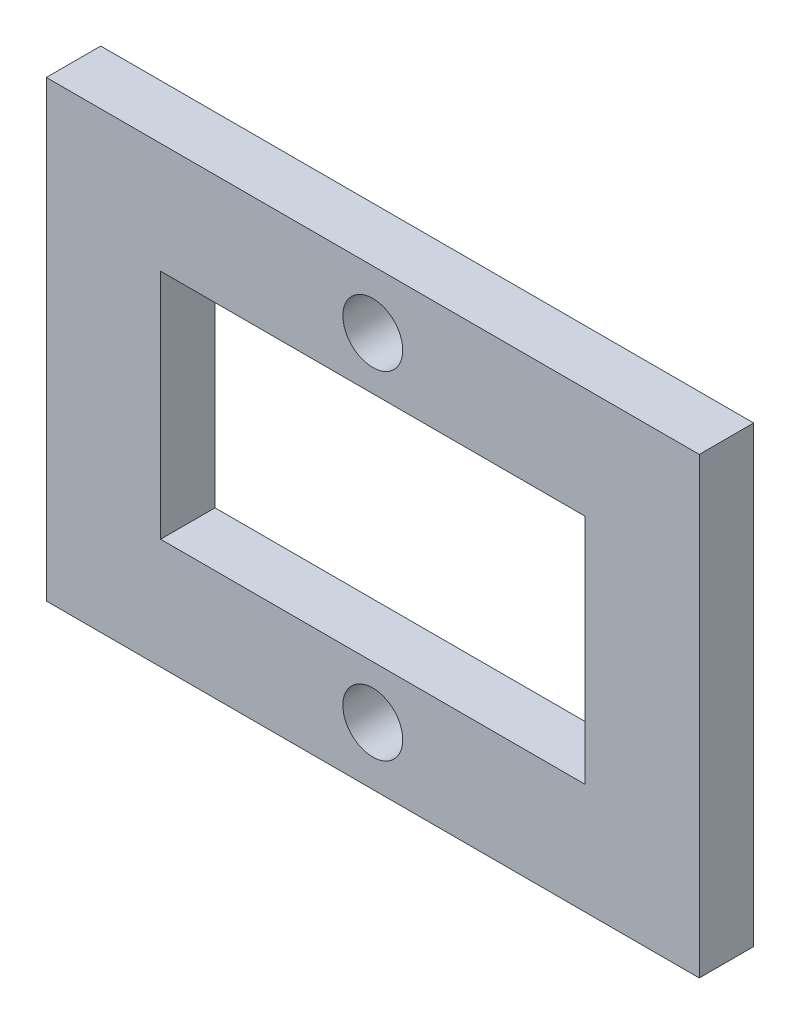
ISO-10303-21;
HEADER;
FILE_DESCRIPTION(('STEP AP214'),'2;1');
FILE_NAME('part.step','',(''),(''),'','','');
FILE_SCHEMA(('AUTOMOTIVE_DESIGN { 1 0 10303 214 1 1 1 1 }'));
ENDSEC;
DATA;
#1=APPLICATION_CONTEXT('core data for automotive mechanical design processes');
#2=APPLICATION_PROTOCOL_DEFINITION('international standard','automotive_design',2000,#1);
#3=PRODUCT_CONTEXT('',#1,'mechanical');
#4=PRODUCT('Part','Part','',(#3));
#5=PRODUCT_RELATED_PRODUCT_CATEGORY('part','',(#4));
#6=PRODUCT_DEFINITION_FORMATION('','',#4);
#7=PRODUCT_DEFINITION_CONTEXT('part definition',#1,'design');
#8=PRODUCT_DEFINITION('design','',#6,#7);
#9=PRODUCT_DEFINITION_SHAPE('','',#8);
#10=(LENGTH_UNIT() NAMED_UNIT(*) SI_UNIT(.MILLI.,.METRE.));
#11=(NAMED_UNIT(*) PLANE_ANGLE_UNIT() SI_UNIT($,.RADIAN.));
#12=(NAMED_UNIT(*) SI_UNIT($,.STERADIAN.) SOLID_ANGLE_UNIT());
#13=UNCERTAINTY_MEASURE_WITH_UNIT(LENGTH_MEASURE(1.E-05),#10,'distance_accuracy_value','');
#14=(GEOMETRIC_REPRESENTATION_CONTEXT(3) GLOBAL_UNCERTAINTY_ASSIGNED_CONTEXT((#13)) GLOBAL_UNIT_ASSIGNED_CONTEXT((#10,
#11,#12)) REPRESENTATION_CONTEXT('',''));
#15=CARTESIAN_POINT('',(0.,0.,0.));
#16=DIRECTION('',(0.,0.,1.));
#17=DIRECTION('',(1.,0.,0.));
#18=AXIS2_PLACEMENT_3D('',#15,#16,#17);
#19=CARTESIAN_POINT('',(244.7,9.3,22.75));
#20=DIRECTION('',(0.,0.,1.));
#21=DIRECTION('',(1.,0.,0.));
#22=AXIS2_PLACEMENT_3D('',#19,#20,#21);
#23=CYLINDRICAL_SURFACE('',#22,1.65);
#24=DIRECTION('',(0.,0.,1.));
#25=VECTOR('',#24,1.);
#26=CARTESIAN_POINT('',(246.35,9.3,22.75));
#27=LINE('',#26,#25);
#28=CARTESIAN_POINT('',(246.35,9.3,23.75));
#29=VERTEX_POINT('',#28);
#30=CARTESIAN_POINT('',(246.35,9.3,26.75));
#31=VERTEX_POINT('',#30);
#32=EDGE_CURVE('E10',#29,#31,#27,.T.);
#33=ORIENTED_EDGE('',*,*,#32,.F.);
#34=CARTESIAN_POINT('',(244.7,9.3,23.75));
#35=DIRECTION('',(0.,0.,1.));
#36=DIRECTION('',(1.,0.,0.));
#37=AXIS2_PLACEMENT_3D('',#34,#35,#36);
#38=CIRCLE('',#37,1.65);
#39=EDGE_CURVE('E219',#29,#29,#38,.T.);
#40=ORIENTED_EDGE('',*,*,#39,.F.);
#41=ORIENTED_EDGE('',*,*,#32,.T.);
#42=CARTESIAN_POINT('',(244.7,9.3,26.75));
#43=DIRECTION('',(0.,0.,1.));
#44=DIRECTION('',(1.,0.,0.));
#45=AXIS2_PLACEMENT_3D('',#42,#43,#44);
#46=CIRCLE('',#45,1.65);
#47=EDGE_CURVE('E181',#31,#31,#46,.T.);
#48=ORIENTED_EDGE('',*,*,#47,.T.);
#49=EDGE_LOOP('',(#33,#40,#41,#48));
#50=FACE_BOUND('',#49,.T.);
#51=ADVANCED_FACE('F15',(#50),#23,.F.);
#52=CARTESIAN_POINT('',(233.,6.4,22.75));
#53=DIRECTION('',(0.,1.,0.));
#54=DIRECTION('',(1.,0.,0.));
#55=AXIS2_PLACEMENT_3D('',#52,#53,#54);
#56=PLANE('',#55);
#57=DIRECTION('',(-1.,0.,0.));
#58=VECTOR('',#57,1.);
#59=CARTESIAN_POINT('',(229.85,6.4,26.75));
#60=LINE('',#59,#58);
#61=CARTESIAN_POINT('',(256.4,6.4,26.75));
#62=VERTEX_POINT('',#61);
#63=CARTESIAN_POINT('',(233.,6.4,26.75));
#64=VERTEX_POINT('',#63);
#65=EDGE_CURVE('E182',#62,#64,#60,.T.);
#66=ORIENTED_EDGE('',*,*,#65,.T.);
#67=DIRECTION('',(0.,0.,1.));
#68=VECTOR('',#67,1.);
#69=CARTESIAN_POINT('',(233.,6.4,22.75));
#70=LINE('',#69,#68);
#71=CARTESIAN_POINT('',(233.,6.4,23.75));
#72=VERTEX_POINT('',#71);
#73=EDGE_CURVE('E23',#72,#64,#70,.T.);
#74=ORIENTED_EDGE('',*,*,#73,.F.);
#75=DIRECTION('',(-1.,0.,0.));
#76=VECTOR('',#75,1.);
#77=CARTESIAN_POINT('',(229.85,6.4,23.75));
#78=LINE('',#77,#76);
#79=CARTESIAN_POINT('',(256.4,6.4,23.75));
#80=VERTEX_POINT('',#79);
#81=EDGE_CURVE('E209',#80,#72,#78,.T.);
#82=ORIENTED_EDGE('',*,*,#81,.F.);
#83=DIRECTION('',(0.,0.,1.));
#84=VECTOR('',#83,1.);
#85=CARTESIAN_POINT('',(256.4,6.4,22.75));
#86=LINE('',#85,#84);
#87=EDGE_CURVE('E161',#80,#62,#86,.T.);
#88=ORIENTED_EDGE('',*,*,#87,.T.);
#89=EDGE_LOOP('',(#66,#74,#82,#88));
#90=FACE_BOUND('',#89,.T.);
#91=ADVANCED_FACE('F235',(#90),#56,.F.);
#92=CARTESIAN_POINT('',(233.,-6.4,22.75));
#93=DIRECTION('',(1.,0.,0.));
#94=DIRECTION('',(0.,1.,0.));
#95=AXIS2_PLACEMENT_3D('',#92,#93,#94);
#96=PLANE('',#95);
#97=DIRECTION('',(0.,0.,1.));
#98=VECTOR('',#97,1.);
#99=CARTESIAN_POINT('',(233.,-6.4,22.75));
#100=LINE('',#99,#98);
#101=CARTESIAN_POINT('',(233.,-6.4,23.75));
#102=VERTEX_POINT('',#101);
#103=CARTESIAN_POINT('',(233.,-6.4,26.75));
#104=VERTEX_POINT('',#103);
#105=EDGE_CURVE('E43',#102,#104,#100,.T.);
#106=ORIENTED_EDGE('',*,*,#105,.F.);
#107=DIRECTION('',(0.,1.,0.));
#108=VECTOR('',#107,1.);
#109=CARTESIAN_POINT('',(233.,-9.45,23.75));
#110=LINE('',#109,#108);
#111=EDGE_CURVE('E213',#102,#72,#110,.T.);
#112=ORIENTED_EDGE('',*,*,#111,.T.);
#113=ORIENTED_EDGE('',*,*,#73,.T.);
#114=DIRECTION('',(0.,1.,0.));
#115=VECTOR('',#114,1.);
#116=CARTESIAN_POINT('',(233.,-9.45,26.75));
#117=LINE('',#116,#115);
#118=EDGE_CURVE('E168',#104,#64,#117,.T.);
#119=ORIENTED_EDGE('',*,*,#118,.F.);
#120=EDGE_LOOP('',(#106,#112,#113,#119));
#121=FACE_BOUND('',#120,.T.);
#122=ADVANCED_FACE('F230',(#121),#96,.T.);
#123=CARTESIAN_POINT('',(256.4,-6.4,22.75));
#124=DIRECTION('',(1.,0.,0.));
#125=DIRECTION('',(0.,1.,0.));
#126=AXIS2_PLACEMENT_3D('',#123,#124,#125);
#127=PLANE('',#126);
#128=DIRECTION('',(0.,1.,0.));
#129=VECTOR('',#128,1.);
#130=CARTESIAN_POINT('',(256.4,-9.45,26.75));
#131=LINE('',#130,#129);
#132=CARTESIAN_POINT('',(256.4,-6.4,26.75));
#133=VERTEX_POINT('',#132);
#134=EDGE_CURVE('E177',#133,#62,#131,.T.);
#135=ORIENTED_EDGE('',*,*,#134,.T.);
#136=ORIENTED_EDGE('',*,*,#87,.F.);
#137=DIRECTION('',(0.,1.,0.));
#138=VECTOR('',#137,1.);
#139=CARTESIAN_POINT('',(256.4,-9.45,23.75));
#140=LINE('',#139,#138);
#141=CARTESIAN_POINT('',(256.4,-6.4,23.75));
#142=VERTEX_POINT('',#141);
#143=EDGE_CURVE('E205',#142,#80,#140,.T.);
#144=ORIENTED_EDGE('',*,*,#143,.F.);
#145=DIRECTION('',(0.,0.,1.));
#146=VECTOR('',#145,1.);
#147=CARTESIAN_POINT('',(256.4,-6.4,22.75));
#148=LINE('',#147,#146);
#149=EDGE_CURVE('E162',#142,#133,#148,.T.);
#150=ORIENTED_EDGE('',*,*,#149,.T.);
#151=EDGE_LOOP('',(#135,#136,#144,#150));
#152=FACE_BOUND('',#151,.T.);
#153=ADVANCED_FACE('F248',(#152),#127,.F.);
#154=CARTESIAN_POINT('',(233.,-6.4,22.75));
#155=DIRECTION('',(0.,1.,0.));
#156=DIRECTION('',(1.,0.,0.));
#157=AXIS2_PLACEMENT_3D('',#154,#155,#156);
#158=PLANE('',#157);
#159=ORIENTED_EDGE('',*,*,#149,.F.);
#160=DIRECTION('',(-1.,0.,0.));
#161=VECTOR('',#160,1.);
#162=CARTESIAN_POINT('',(229.85,-6.4,23.75));
#163=LINE('',#162,#161);
#164=EDGE_CURVE('E216',#142,#102,#163,.T.);
#165=ORIENTED_EDGE('',*,*,#164,.T.);
#166=ORIENTED_EDGE('',*,*,#105,.T.);
#167=DIRECTION('',(-1.,0.,0.));
#168=VECTOR('',#167,1.);
#169=CARTESIAN_POINT('',(229.85,-6.4,26.75));
#170=LINE('',#169,#168);
#171=EDGE_CURVE('E164',#133,#104,#170,.T.);
#172=ORIENTED_EDGE('',*,*,#171,.F.);
#173=EDGE_LOOP('',(#159,#165,#166,#172));
#174=FACE_BOUND('',#173,.T.);
#175=ADVANCED_FACE('F241',(#174),#158,.T.);
#176=CARTESIAN_POINT('',(244.7,-9.3,22.75));
#177=DIRECTION('',(0.,0.,1.));
#178=DIRECTION('',(1.,0.,0.));
#179=AXIS2_PLACEMENT_3D('',#176,#177,#178);
#180=CYLINDRICAL_SURFACE('',#179,1.65);
#181=DIRECTION('',(0.,0.,1.));
#182=VECTOR('',#181,1.);
#183=CARTESIAN_POINT('',(246.35,-9.3,22.75));
#184=LINE('',#183,#182);
#185=CARTESIAN_POINT('',(246.35,-9.3,23.75));
#186=VERTEX_POINT('',#185);
#187=CARTESIAN_POINT('',(246.35,-9.3,26.75));
#188=VERTEX_POINT('',#187);
#189=EDGE_CURVE('E222',#186,#188,#184,.T.);
#190=ORIENTED_EDGE('',*,*,#189,.F.);
#191=CARTESIAN_POINT('',(244.7,-9.3,23.75));
#192=DIRECTION('',(0.,0.,1.));
#193=DIRECTION('',(1.,0.,0.));
#194=AXIS2_PLACEMENT_3D('',#191,#192,#193);
#195=CIRCLE('',#194,1.65);
#196=EDGE_CURVE('E201',#186,#186,#195,.T.);
#197=ORIENTED_EDGE('',*,*,#196,.F.);
#198=ORIENTED_EDGE('',*,*,#189,.T.);
#199=CARTESIAN_POINT('',(244.7,-9.3,26.75));
#200=DIRECTION('',(0.,0.,1.));
#201=DIRECTION('',(1.,0.,0.));
#202=AXIS2_PLACEMENT_3D('',#199,#200,#201);
#203=CIRCLE('',#202,1.65);
#204=EDGE_CURVE('E169',#188,#188,#203,.T.);
#205=ORIENTED_EDGE('',*,*,#204,.T.);
#206=EDGE_LOOP('',(#190,#197,#198,#205));
#207=FACE_BOUND('',#206,.T.);
#208=ADVANCED_FACE('F256',(#207),#180,.F.);
#209=CARTESIAN_POINT('',(262.7,-12.5,23.75));
#210=DIRECTION('',(1.,0.,0.));
#211=DIRECTION('',(0.,1.,0.));
#212=AXIS2_PLACEMENT_3D('',#209,#210,#211);
#213=PLANE('',#212);
#214=DIRECTION('',(0.,0.,1.));
#215=VECTOR('',#214,1.);
#216=CARTESIAN_POINT('',(262.7,-12.5,23.75));
#217=LINE('',#216,#215);
#218=CARTESIAN_POINT('',(262.7,-12.5,23.75));
#219=VERTEX_POINT('',#218);
#220=CARTESIAN_POINT('',(262.7,-12.5,26.75));
#221=VERTEX_POINT('',#220);
#222=EDGE_CURVE('E126',#219,#221,#217,.T.);
#223=ORIENTED_EDGE('',*,*,#222,.F.);
#224=DIRECTION('',(0.,1.,0.));
#225=VECTOR('',#224,1.);
#226=CARTESIAN_POINT('',(262.7,-12.5,23.75));
#227=LINE('',#226,#225);
#228=CARTESIAN_POINT('',(262.7,12.5,23.75));
#229=VERTEX_POINT('',#228);
#230=EDGE_CURVE('E198',#219,#229,#227,.T.);
#231=ORIENTED_EDGE('',*,*,#230,.T.);
#232=DIRECTION('',(0.,0.,1.));
#233=VECTOR('',#232,1.);
#234=CARTESIAN_POINT('',(262.7,12.5,23.75));
#235=LINE('',#234,#233);
#236=CARTESIAN_POINT('',(262.7,12.5,26.75));
#237=VERTEX_POINT('',#236);
#238=EDGE_CURVE('E195',#229,#237,#235,.T.);
#239=ORIENTED_EDGE('',*,*,#238,.T.);
#240=DIRECTION('',(0.,1.,0.));
#241=VECTOR('',#240,1.);
#242=CARTESIAN_POINT('',(262.7,-12.5,26.75));
#243=LINE('',#242,#241);
#244=EDGE_CURVE('E157',#221,#237,#243,.T.);
#245=ORIENTED_EDGE('',*,*,#244,.F.);
#246=EDGE_LOOP('',(#223,#231,#239,#245));
#247=FACE_BOUND('',#246,.T.);
#248=ADVANCED_FACE('F295',(#247),#213,.T.);
#249=CARTESIAN_POINT('',(226.7,-12.5,23.75));
#250=DIRECTION('',(0.,0.,1.));
#251=DIRECTION('',(1.,0.,0.));
#252=AXIS2_PLACEMENT_3D('',#249,#250,#251);
#253=PLANE('',#252);
#254=ORIENTED_EDGE('',*,*,#39,.T.);
#255=EDGE_LOOP('',(#254));
#256=FACE_BOUND('',#255,.T.);
#257=ORIENTED_EDGE('',*,*,#143,.T.);
#258=ORIENTED_EDGE('',*,*,#81,.T.);
#259=ORIENTED_EDGE('',*,*,#111,.F.);
#260=ORIENTED_EDGE('',*,*,#164,.F.);
#261=EDGE_LOOP('',(#257,#258,#259,#260));
#262=FACE_BOUND('',#261,.T.);
#263=ORIENTED_EDGE('',*,*,#196,.T.);
#264=EDGE_LOOP('',(#263));
#265=FACE_BOUND('',#264,.T.);
#266=DIRECTION('',(1.,0.,0.));
#267=VECTOR('',#266,1.);
#268=CARTESIAN_POINT('',(226.7,12.5,23.75));
#269=LINE('',#268,#267);
#270=CARTESIAN_POINT('',(226.7,12.5,23.75));
#271=VERTEX_POINT('',#270);
#272=EDGE_CURVE('E191',#271,#229,#269,.T.);
#273=ORIENTED_EDGE('',*,*,#272,.T.);
#274=ORIENTED_EDGE('',*,*,#230,.F.);
#275=DIRECTION('',(1.,0.,0.));
#276=VECTOR('',#275,1.);
#277=CARTESIAN_POINT('',(226.7,-12.5,23.75));
#278=LINE('',#277,#276);
#279=CARTESIAN_POINT('',(226.7,-12.5,23.75));
#280=VERTEX_POINT('',#279);
#281=EDGE_CURVE('E131',#280,#219,#278,.T.);
#282=ORIENTED_EDGE('',*,*,#281,.F.);
#283=DIRECTION('',(0.,1.,0.));
#284=VECTOR('',#283,1.);
#285=CARTESIAN_POINT('',(226.7,-12.5,23.75));
#286=LINE('',#285,#284);
#287=EDGE_CURVE('E139',#280,#271,#286,.T.);
#288=ORIENTED_EDGE('',*,*,#287,.T.);
#289=EDGE_LOOP('',(#273,#274,#282,#288));
#290=FACE_BOUND('',#289,.T.);
#291=ADVANCED_FACE('F245',(#256,#262,#265,#290),#253,.F.);
#292=CARTESIAN_POINT('',(226.7,12.5,23.75));
#293=DIRECTION('',(0.,1.,0.));
#294=DIRECTION('',(1.,0.,0.));
#295=AXIS2_PLACEMENT_3D('',#292,#293,#294);
#296=PLANE('',#295);
#297=ORIENTED_EDGE('',*,*,#272,.F.);
#298=DIRECTION('',(0.,0.,1.));
#299=VECTOR('',#298,1.);
#300=CARTESIAN_POINT('',(226.7,12.5,23.75));
#301=LINE('',#300,#299);
#302=CARTESIAN_POINT('',(226.7,12.5,26.75));
#303=VERTEX_POINT('',#302);
#304=EDGE_CURVE('E147',#271,#303,#301,.T.);
#305=ORIENTED_EDGE('',*,*,#304,.T.);
#306=DIRECTION('',(1.,0.,0.));
#307=VECTOR('',#306,1.);
#308=CARTESIAN_POINT('',(226.7,12.5,26.75));
#309=LINE('',#308,#307);
#310=EDGE_CURVE('E144',#303,#237,#309,.T.);
#311=ORIENTED_EDGE('',*,*,#310,.T.);
#312=ORIENTED_EDGE('',*,*,#238,.F.);
#313=EDGE_LOOP('',(#297,#305,#311,#312));
#314=FACE_BOUND('',#313,.T.);
#315=ADVANCED_FACE('F314',(#314),#296,.T.);
#316=CARTESIAN_POINT('',(226.7,-12.5,26.75));
#317=DIRECTION('',(0.,0.,1.));
#318=DIRECTION('',(1.,0.,0.));
#319=AXIS2_PLACEMENT_3D('',#316,#317,#318);
#320=PLANE('',#319);
#321=ORIENTED_EDGE('',*,*,#47,.F.);
#322=EDGE_LOOP('',(#321));
#323=FACE_BOUND('',#322,.T.);
#324=ORIENTED_EDGE('',*,*,#171,.T.);
#325=ORIENTED_EDGE('',*,*,#118,.T.);
#326=ORIENTED_EDGE('',*,*,#65,.F.);
#327=ORIENTED_EDGE('',*,*,#134,.F.);
#328=EDGE_LOOP('',(#324,#325,#326,#327));
#329=FACE_BOUND('',#328,.T.);
#330=ORIENTED_EDGE('',*,*,#204,.F.);
#331=EDGE_LOOP('',(#330));
#332=FACE_BOUND('',#331,.T.);
#333=DIRECTION('',(0.,1.,0.));
#334=VECTOR('',#333,1.);
#335=CARTESIAN_POINT('',(226.7,-12.5,26.75));
#336=LINE('',#335,#334);
#337=CARTESIAN_POINT('',(226.7,-12.5,26.75));
#338=VERTEX_POINT('',#337);
#339=EDGE_CURVE('E137',#338,#303,#336,.T.);
#340=ORIENTED_EDGE('',*,*,#339,.F.);
#341=DIRECTION('',(1.,0.,0.));
#342=VECTOR('',#341,1.);
#343=CARTESIAN_POINT('',(226.7,-12.5,26.75));
#344=LINE('',#343,#342);
#345=EDGE_CURVE('E119',#338,#221,#344,.T.);
#346=ORIENTED_EDGE('',*,*,#345,.T.);
#347=ORIENTED_EDGE('',*,*,#244,.T.);
#348=ORIENTED_EDGE('',*,*,#310,.F.);
#349=EDGE_LOOP('',(#340,#346,#347,#348));
#350=FACE_BOUND('',#349,.T.);
#351=ADVANCED_FACE('F142',(#323,#329,#332,#350),#320,.T.);
#352=CARTESIAN_POINT('',(226.7,-12.5,23.75));
#353=DIRECTION('',(0.,1.,0.));
#354=DIRECTION('',(1.,0.,0.));
#355=AXIS2_PLACEMENT_3D('',#352,#353,#354);
#356=PLANE('',#355);
#357=ORIENTED_EDGE('',*,*,#222,.T.);
#358=ORIENTED_EDGE('',*,*,#345,.F.);
#359=DIRECTION('',(0.,0.,1.));
#360=VECTOR('',#359,1.);
#361=CARTESIAN_POINT('',(226.7,-12.5,23.75));
#362=LINE('',#361,#360);
#363=EDGE_CURVE('E123',#280,#338,#362,.T.);
#364=ORIENTED_EDGE('',*,*,#363,.F.);
#365=ORIENTED_EDGE('',*,*,#281,.T.);
#366=EDGE_LOOP('',(#357,#358,#364,#365));
#367=FACE_BOUND('',#366,.T.);
#368=ADVANCED_FACE('F121',(#367),#356,.F.);
#369=CARTESIAN_POINT('',(226.7,-12.5,23.75));
#370=DIRECTION('',(1.,0.,0.));
#371=DIRECTION('',(0.,1.,0.));
#372=AXIS2_PLACEMENT_3D('',#369,#370,#371);
#373=PLANE('',#372);
#374=ORIENTED_EDGE('',*,*,#339,.T.);
#375=ORIENTED_EDGE('',*,*,#304,.F.);
#376=ORIENTED_EDGE('',*,*,#287,.F.);
#377=ORIENTED_EDGE('',*,*,#363,.T.);
#378=EDGE_LOOP('',(#374,#375,#376,#377));
#379=FACE_BOUND('',#378,.T.);
#380=ADVANCED_FACE('F135',(#379),#373,.F.);
#381=CLOSED_SHELL('',(#51,#91,#122,#153,#175,#208,#248,#291,#315,#351,#368,#380));
#382=MANIFOLD_SOLID_BREP('B1',#381);
#383=ADVANCED_BREP_SHAPE_REPRESENTATION('',(#18,#382),#14);
#384=SHAPE_DEFINITION_REPRESENTATION(#9,#383);
ENDSEC;
END-ISO-10303-21;
